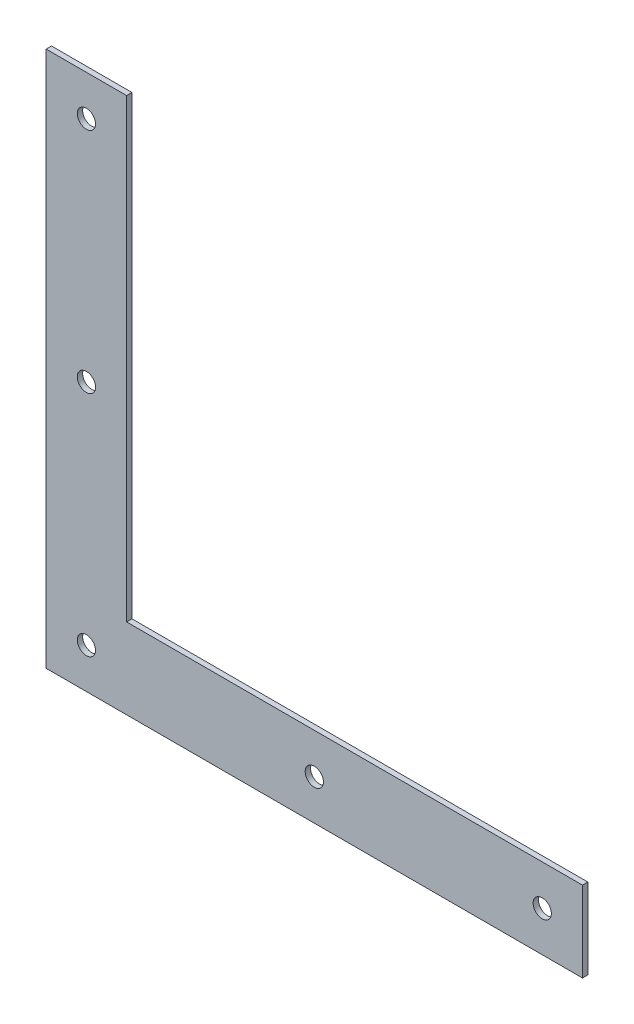
ISO-10303-21;
HEADER;
FILE_DESCRIPTION(('STEP AP214'),'2;1');
FILE_NAME('part.step','',(''),(''),'','','');
FILE_SCHEMA(('AUTOMOTIVE_DESIGN { 1 0 10303 214 1 1 1 1 }'));
ENDSEC;
DATA;
#1=APPLICATION_CONTEXT('core data for automotive mechanical design processes');
#2=APPLICATION_PROTOCOL_DEFINITION('international standard','automotive_design',2000,#1);
#3=PRODUCT_CONTEXT('',#1,'mechanical');
#4=PRODUCT('Part','Part','',(#3));
#5=PRODUCT_RELATED_PRODUCT_CATEGORY('part','',(#4));
#6=PRODUCT_DEFINITION_FORMATION('','',#4);
#7=PRODUCT_DEFINITION_CONTEXT('part definition',#1,'design');
#8=PRODUCT_DEFINITION('design','',#6,#7);
#9=PRODUCT_DEFINITION_SHAPE('','',#8);
#10=(LENGTH_UNIT() NAMED_UNIT(*) SI_UNIT(.MILLI.,.METRE.));
#11=(NAMED_UNIT(*) PLANE_ANGLE_UNIT() SI_UNIT($,.RADIAN.));
#12=(NAMED_UNIT(*) SI_UNIT($,.STERADIAN.) SOLID_ANGLE_UNIT());
#13=UNCERTAINTY_MEASURE_WITH_UNIT(LENGTH_MEASURE(1.E-05),#10,'distance_accuracy_value','');
#14=(GEOMETRIC_REPRESENTATION_CONTEXT(3) GLOBAL_UNCERTAINTY_ASSIGNED_CONTEXT((#13)) GLOBAL_UNIT_ASSIGNED_CONTEXT((#10,
#11,#12)) REPRESENTATION_CONTEXT('',''));
#15=CARTESIAN_POINT('',(0.,0.,0.));
#16=DIRECTION('',(0.,0.,1.));
#17=DIRECTION('',(1.,0.,0.));
#18=AXIS2_PLACEMENT_3D('',#15,#16,#17);
#19=CARTESIAN_POINT('',(100.,0.,1.));
#20=DIRECTION('',(0.,1.,0.));
#21=DIRECTION('',(-1.,0.,0.));
#22=AXIS2_PLACEMENT_3D('',#19,#20,#21);
#23=PLANE('',#22);
#24=DIRECTION('',(1.,0.,0.));
#25=VECTOR('',#24,1.);
#26=CARTESIAN_POINT('',(100.,0.,0.));
#27=LINE('',#26,#25);
#28=CARTESIAN_POINT('',(0.,0.,0.));
#29=VERTEX_POINT('',#28);
#30=CARTESIAN_POINT('',(100.,0.,0.));
#31=VERTEX_POINT('',#30);
#32=EDGE_CURVE('E116',#29,#31,#27,.T.);
#33=ORIENTED_EDGE('',*,*,#32,.T.);
#34=DIRECTION('',(0.,0.,-1.));
#35=VECTOR('',#34,1.);
#36=CARTESIAN_POINT('',(100.,0.,1.));
#37=LINE('',#36,#35);
#38=CARTESIAN_POINT('',(100.,0.,1.));
#39=VERTEX_POINT('',#38);
#40=EDGE_CURVE('E11',#39,#31,#37,.T.);
#41=ORIENTED_EDGE('',*,*,#40,.F.);
#42=DIRECTION('',(1.,0.,0.));
#43=VECTOR('',#42,1.);
#44=CARTESIAN_POINT('',(100.,0.,1.));
#45=LINE('',#44,#43);
#46=CARTESIAN_POINT('',(0.,0.,1.));
#47=VERTEX_POINT('',#46);
#48=EDGE_CURVE('E127',#47,#39,#45,.T.);
#49=ORIENTED_EDGE('',*,*,#48,.F.);
#50=DIRECTION('',(0.,0.,-1.));
#51=VECTOR('',#50,1.);
#52=CARTESIAN_POINT('',(0.,0.,1.));
#53=LINE('',#52,#51);
#54=EDGE_CURVE('E112',#47,#29,#53,.T.);
#55=ORIENTED_EDGE('',*,*,#54,.T.);
#56=EDGE_LOOP('',(#33,#41,#49,#55));
#57=FACE_BOUND('',#56,.T.);
#58=ADVANCED_FACE('F32',(#57),#23,.F.);
#59=CARTESIAN_POINT('',(100.,15.,1.));
#60=DIRECTION('',(-1.,0.,0.));
#61=DIRECTION('',(0.,0.,1.));
#62=AXIS2_PLACEMENT_3D('',#59,#60,#61);
#63=PLANE('',#62);
#64=DIRECTION('',(0.,1.,0.));
#65=VECTOR('',#64,1.);
#66=CARTESIAN_POINT('',(100.,15.,0.));
#67=LINE('',#66,#65);
#68=CARTESIAN_POINT('',(100.,15.,0.));
#69=VERTEX_POINT('',#68);
#70=EDGE_CURVE('E119',#31,#69,#67,.T.);
#71=ORIENTED_EDGE('',*,*,#70,.T.);
#72=DIRECTION('',(0.,0.,-1.));
#73=VECTOR('',#72,1.);
#74=CARTESIAN_POINT('',(100.,15.,1.));
#75=LINE('',#74,#73);
#76=CARTESIAN_POINT('',(100.,15.,1.));
#77=VERTEX_POINT('',#76);
#78=EDGE_CURVE('E40',#77,#69,#75,.T.);
#79=ORIENTED_EDGE('',*,*,#78,.F.);
#80=DIRECTION('',(0.,1.,0.));
#81=VECTOR('',#80,1.);
#82=CARTESIAN_POINT('',(100.,15.,1.));
#83=LINE('',#82,#81);
#84=EDGE_CURVE('E85',#39,#77,#83,.T.);
#85=ORIENTED_EDGE('',*,*,#84,.F.);
#86=ORIENTED_EDGE('',*,*,#40,.T.);
#87=EDGE_LOOP('',(#71,#79,#85,#86));
#88=FACE_BOUND('',#87,.T.);
#89=ADVANCED_FACE('F152',(#88),#63,.F.);
#90=CARTESIAN_POINT('',(15.,15.,1.));
#91=DIRECTION('',(0.,-1.,0.));
#92=DIRECTION('',(0.,0.,-1.));
#93=AXIS2_PLACEMENT_3D('',#90,#91,#92);
#94=PLANE('',#93);
#95=DIRECTION('',(-1.,0.,0.));
#96=VECTOR('',#95,1.);
#97=CARTESIAN_POINT('',(15.,15.,0.));
#98=LINE('',#97,#96);
#99=CARTESIAN_POINT('',(15.,15.,0.));
#100=VERTEX_POINT('',#99);
#101=EDGE_CURVE('E122',#69,#100,#98,.T.);
#102=ORIENTED_EDGE('',*,*,#101,.T.);
#103=DIRECTION('',(0.,0.,-1.));
#104=VECTOR('',#103,1.);
#105=CARTESIAN_POINT('',(15.,15.,1.));
#106=LINE('',#105,#104);
#107=CARTESIAN_POINT('',(15.,15.,1.));
#108=VERTEX_POINT('',#107);
#109=EDGE_CURVE('E107',#108,#100,#106,.T.);
#110=ORIENTED_EDGE('',*,*,#109,.F.);
#111=DIRECTION('',(-1.,0.,0.));
#112=VECTOR('',#111,1.);
#113=CARTESIAN_POINT('',(15.,15.,1.));
#114=LINE('',#113,#112);
#115=EDGE_CURVE('E98',#77,#108,#114,.T.);
#116=ORIENTED_EDGE('',*,*,#115,.F.);
#117=ORIENTED_EDGE('',*,*,#78,.T.);
#118=EDGE_LOOP('',(#102,#110,#116,#117));
#119=FACE_BOUND('',#118,.T.);
#120=ADVANCED_FACE('F133',(#119),#94,.F.);
#121=CARTESIAN_POINT('',(15.,100.,1.));
#122=DIRECTION('',(-1.,0.,0.));
#123=DIRECTION('',(0.,-1.,0.));
#124=AXIS2_PLACEMENT_3D('',#121,#122,#123);
#125=PLANE('',#124);
#126=DIRECTION('',(0.,1.,0.));
#127=VECTOR('',#126,1.);
#128=CARTESIAN_POINT('',(15.,100.,0.));
#129=LINE('',#128,#127);
#130=CARTESIAN_POINT('',(15.,100.,0.));
#131=VERTEX_POINT('',#130);
#132=EDGE_CURVE('E106',#100,#131,#129,.T.);
#133=ORIENTED_EDGE('',*,*,#132,.T.);
#134=DIRECTION('',(0.,0.,-1.));
#135=VECTOR('',#134,1.);
#136=CARTESIAN_POINT('',(15.,100.,1.));
#137=LINE('',#136,#135);
#138=CARTESIAN_POINT('',(15.,100.,1.));
#139=VERTEX_POINT('',#138);
#140=EDGE_CURVE('E103',#139,#131,#137,.T.);
#141=ORIENTED_EDGE('',*,*,#140,.F.);
#142=DIRECTION('',(0.,1.,0.));
#143=VECTOR('',#142,1.);
#144=CARTESIAN_POINT('',(15.,100.,1.));
#145=LINE('',#144,#143);
#146=EDGE_CURVE('E92',#108,#139,#145,.T.);
#147=ORIENTED_EDGE('',*,*,#146,.F.);
#148=ORIENTED_EDGE('',*,*,#109,.T.);
#149=EDGE_LOOP('',(#133,#141,#147,#148));
#150=FACE_BOUND('',#149,.T.);
#151=ADVANCED_FACE('F104',(#150),#125,.F.);
#152=CARTESIAN_POINT('',(0.,100.,1.));
#153=DIRECTION('',(0.,-1.,0.));
#154=DIRECTION('',(0.,0.,-1.));
#155=AXIS2_PLACEMENT_3D('',#152,#153,#154);
#156=PLANE('',#155);
#157=DIRECTION('',(-1.,0.,0.));
#158=VECTOR('',#157,1.);
#159=CARTESIAN_POINT('',(0.,100.,0.));
#160=LINE('',#159,#158);
#161=CARTESIAN_POINT('',(0.,100.,0.));
#162=VERTEX_POINT('',#161);
#163=EDGE_CURVE('E71',#131,#162,#160,.T.);
#164=ORIENTED_EDGE('',*,*,#163,.T.);
#165=DIRECTION('',(0.,0.,-1.));
#166=VECTOR('',#165,1.);
#167=CARTESIAN_POINT('',(0.,100.,1.));
#168=LINE('',#167,#166);
#169=CARTESIAN_POINT('',(0.,100.,1.));
#170=VERTEX_POINT('',#169);
#171=EDGE_CURVE('E108',#170,#162,#168,.T.);
#172=ORIENTED_EDGE('',*,*,#171,.F.);
#173=DIRECTION('',(-1.,0.,0.));
#174=VECTOR('',#173,1.);
#175=CARTESIAN_POINT('',(0.,100.,1.));
#176=LINE('',#175,#174);
#177=EDGE_CURVE('E96',#139,#170,#176,.T.);
#178=ORIENTED_EDGE('',*,*,#177,.F.);
#179=ORIENTED_EDGE('',*,*,#140,.T.);
#180=EDGE_LOOP('',(#164,#172,#178,#179));
#181=FACE_BOUND('',#180,.T.);
#182=ADVANCED_FACE('F110',(#181),#156,.F.);
#183=CARTESIAN_POINT('',(0.,0.,1.));
#184=DIRECTION('',(1.,0.,0.));
#185=DIRECTION('',(0.,0.,-1.));
#186=AXIS2_PLACEMENT_3D('',#183,#184,#185);
#187=PLANE('',#186);
#188=DIRECTION('',(0.,-1.,0.));
#189=VECTOR('',#188,1.);
#190=CARTESIAN_POINT('',(0.,0.,0.));
#191=LINE('',#190,#189);
#192=EDGE_CURVE('E77',#162,#29,#191,.T.);
#193=ORIENTED_EDGE('',*,*,#192,.T.);
#194=ORIENTED_EDGE('',*,*,#54,.F.);
#195=DIRECTION('',(0.,-1.,0.));
#196=VECTOR('',#195,1.);
#197=CARTESIAN_POINT('',(0.,0.,1.));
#198=LINE('',#197,#196);
#199=EDGE_CURVE('E48',#170,#47,#198,.T.);
#200=ORIENTED_EDGE('',*,*,#199,.F.);
#201=ORIENTED_EDGE('',*,*,#171,.T.);
#202=EDGE_LOOP('',(#193,#194,#200,#201));
#203=FACE_BOUND('',#202,.T.);
#204=ADVANCED_FACE('F140',(#203),#187,.F.);
#205=CARTESIAN_POINT('',(0.,0.,1.));
#206=DIRECTION('',(0.,0.,-1.));
#207=DIRECTION('',(-1.,0.,0.));
#208=AXIS2_PLACEMENT_3D('',#205,#206,#207);
#209=PLANE('',#208);
#210=CARTESIAN_POINT('',(92.5,7.50000000000001,1.));
#211=DIRECTION('',(0.,0.,-1.));
#212=DIRECTION('',(-1.,0.,0.));
#213=AXIS2_PLACEMENT_3D('',#210,#211,#212);
#214=CIRCLE('',#213,1.69999999999999);
#215=CARTESIAN_POINT('',(90.8,7.50000000000001,1.));
#216=VERTEX_POINT('',#215);
#217=EDGE_CURVE('E245',#216,#216,#214,.T.);
#218=ORIENTED_EDGE('',*,*,#217,.T.);
#219=EDGE_LOOP('',(#218));
#220=FACE_BOUND('',#219,.T.);
#221=CARTESIAN_POINT('',(7.5,7.50000000000001,1.));
#222=DIRECTION('',(0.,0.,-1.));
#223=DIRECTION('',(-1.,0.,0.));
#224=AXIS2_PLACEMENT_3D('',#221,#222,#223);
#225=CIRCLE('',#224,1.7);
#226=CARTESIAN_POINT('',(5.8,7.50000000000001,1.));
#227=VERTEX_POINT('',#226);
#228=EDGE_CURVE('E255',#227,#227,#225,.T.);
#229=ORIENTED_EDGE('',*,*,#228,.T.);
#230=EDGE_LOOP('',(#229));
#231=FACE_BOUND('',#230,.T.);
#232=CARTESIAN_POINT('',(7.5,92.5,1.));
#233=DIRECTION('',(0.,0.,-1.));
#234=DIRECTION('',(-1.,0.,0.));
#235=AXIS2_PLACEMENT_3D('',#232,#233,#234);
#236=CIRCLE('',#235,1.7);
#237=CARTESIAN_POINT('',(5.8,92.5,1.));
#238=VERTEX_POINT('',#237);
#239=EDGE_CURVE('E261',#238,#238,#236,.T.);
#240=ORIENTED_EDGE('',*,*,#239,.T.);
#241=EDGE_LOOP('',(#240));
#242=FACE_BOUND('',#241,.T.);
#243=CARTESIAN_POINT('',(7.5,50.,1.));
#244=DIRECTION('',(0.,0.,-1.));
#245=DIRECTION('',(-1.,0.,0.));
#246=AXIS2_PLACEMENT_3D('',#243,#244,#245);
#247=CIRCLE('',#246,1.7);
#248=CARTESIAN_POINT('',(5.8,50.,1.));
#249=VERTEX_POINT('',#248);
#250=EDGE_CURVE('E267',#249,#249,#247,.T.);
#251=ORIENTED_EDGE('',*,*,#250,.T.);
#252=EDGE_LOOP('',(#251));
#253=FACE_BOUND('',#252,.T.);
#254=CARTESIAN_POINT('',(50.,7.50000000000001,1.));
#255=DIRECTION('',(0.,0.,-1.));
#256=DIRECTION('',(-1.,0.,0.));
#257=AXIS2_PLACEMENT_3D('',#254,#255,#256);
#258=CIRCLE('',#257,1.7);
#259=CARTESIAN_POINT('',(48.3,7.50000000000001,1.));
#260=VERTEX_POINT('',#259);
#261=EDGE_CURVE('E120',#260,#260,#258,.T.);
#262=ORIENTED_EDGE('',*,*,#261,.T.);
#263=EDGE_LOOP('',(#262));
#264=FACE_BOUND('',#263,.T.);
#265=ORIENTED_EDGE('',*,*,#48,.T.);
#266=ORIENTED_EDGE('',*,*,#84,.T.);
#267=ORIENTED_EDGE('',*,*,#115,.T.);
#268=ORIENTED_EDGE('',*,*,#146,.T.);
#269=ORIENTED_EDGE('',*,*,#177,.T.);
#270=ORIENTED_EDGE('',*,*,#199,.T.);
#271=EDGE_LOOP('',(#265,#266,#267,#268,#269,#270));
#272=FACE_BOUND('',#271,.T.);
#273=ADVANCED_FACE('F94',(#220,#231,#242,#253,#264,#272),#209,.F.);
#274=CARTESIAN_POINT('',(0.,0.,0.));
#275=DIRECTION('',(0.,0.,-1.));
#276=DIRECTION('',(-1.,0.,0.));
#277=AXIS2_PLACEMENT_3D('',#274,#275,#276);
#278=PLANE('',#277);
#279=CARTESIAN_POINT('',(92.5,7.50000000000001,0.));
#280=DIRECTION('',(0.,0.,-1.));
#281=DIRECTION('',(-1.,0.,0.));
#282=AXIS2_PLACEMENT_3D('',#279,#280,#281);
#283=CIRCLE('',#282,1.69999999999999);
#284=CARTESIAN_POINT('',(90.8,7.50000000000001,0.));
#285=VERTEX_POINT('',#284);
#286=EDGE_CURVE('E248',#285,#285,#283,.T.);
#287=ORIENTED_EDGE('',*,*,#286,.F.);
#288=EDGE_LOOP('',(#287));
#289=FACE_BOUND('',#288,.T.);
#290=CARTESIAN_POINT('',(7.5,7.50000000000001,0.));
#291=DIRECTION('',(0.,0.,-1.));
#292=DIRECTION('',(-1.,0.,0.));
#293=AXIS2_PLACEMENT_3D('',#290,#291,#292);
#294=CIRCLE('',#293,1.69999999999999);
#295=CARTESIAN_POINT('',(5.80000000000001,7.50000000000001,0.));
#296=VERTEX_POINT('',#295);
#297=EDGE_CURVE('E250',#296,#296,#294,.T.);
#298=ORIENTED_EDGE('',*,*,#297,.F.);
#299=EDGE_LOOP('',(#298));
#300=FACE_BOUND('',#299,.T.);
#301=CARTESIAN_POINT('',(7.5,92.5,0.));
#302=DIRECTION('',(0.,0.,-1.));
#303=DIRECTION('',(-1.,0.,0.));
#304=AXIS2_PLACEMENT_3D('',#301,#302,#303);
#305=CIRCLE('',#304,1.69999999999999);
#306=CARTESIAN_POINT('',(5.80000000000001,92.5,0.));
#307=VERTEX_POINT('',#306);
#308=EDGE_CURVE('E258',#307,#307,#305,.T.);
#309=ORIENTED_EDGE('',*,*,#308,.F.);
#310=EDGE_LOOP('',(#309));
#311=FACE_BOUND('',#310,.T.);
#312=CARTESIAN_POINT('',(7.5,50.,0.));
#313=DIRECTION('',(0.,0.,-1.));
#314=DIRECTION('',(-1.,0.,0.));
#315=AXIS2_PLACEMENT_3D('',#312,#313,#314);
#316=CIRCLE('',#315,1.69999999999999);
#317=CARTESIAN_POINT('',(5.80000000000001,50.,0.));
#318=VERTEX_POINT('',#317);
#319=EDGE_CURVE('E264',#318,#318,#316,.T.);
#320=ORIENTED_EDGE('',*,*,#319,.F.);
#321=EDGE_LOOP('',(#320));
#322=FACE_BOUND('',#321,.T.);
#323=CARTESIAN_POINT('',(50.,7.50000000000001,0.));
#324=DIRECTION('',(0.,0.,-1.));
#325=DIRECTION('',(-1.,0.,0.));
#326=AXIS2_PLACEMENT_3D('',#323,#324,#325);
#327=CIRCLE('',#326,1.69999999999999);
#328=CARTESIAN_POINT('',(48.3,7.50000000000001,0.));
#329=VERTEX_POINT('',#328);
#330=EDGE_CURVE('E270',#329,#329,#327,.T.);
#331=ORIENTED_EDGE('',*,*,#330,.F.);
#332=EDGE_LOOP('',(#331));
#333=FACE_BOUND('',#332,.T.);
#334=ORIENTED_EDGE('',*,*,#32,.F.);
#335=ORIENTED_EDGE('',*,*,#192,.F.);
#336=ORIENTED_EDGE('',*,*,#163,.F.);
#337=ORIENTED_EDGE('',*,*,#132,.F.);
#338=ORIENTED_EDGE('',*,*,#101,.F.);
#339=ORIENTED_EDGE('',*,*,#70,.F.);
#340=EDGE_LOOP('',(#334,#335,#336,#337,#338,#339));
#341=FACE_BOUND('',#340,.T.);
#342=ADVANCED_FACE('F136',(#289,#300,#311,#322,#333,#341),#278,.T.);
#343=CARTESIAN_POINT('',(50.,7.50000000000001,0.));
#344=DIRECTION('',(0.,0.,-1.));
#345=DIRECTION('',(-1.,0.,0.));
#346=AXIS2_PLACEMENT_3D('',#343,#344,#345);
#347=CYLINDRICAL_SURFACE('',#346,1.69999999999999);
#348=ORIENTED_EDGE('',*,*,#261,.F.);
#349=EDGE_LOOP('',(#348));
#350=FACE_BOUND('',#349,.T.);
#351=ORIENTED_EDGE('',*,*,#330,.T.);
#352=EDGE_LOOP('',(#351));
#353=FACE_BOUND('',#352,.T.);
#354=ADVANCED_FACE('F189',(#350,#353),#347,.F.);
#355=CARTESIAN_POINT('',(7.5,50.,0.));
#356=DIRECTION('',(0.,0.,-1.));
#357=DIRECTION('',(-1.,0.,0.));
#358=AXIS2_PLACEMENT_3D('',#355,#356,#357);
#359=CYLINDRICAL_SURFACE('',#358,1.69999999999999);
#360=ORIENTED_EDGE('',*,*,#250,.F.);
#361=EDGE_LOOP('',(#360));
#362=FACE_BOUND('',#361,.T.);
#363=ORIENTED_EDGE('',*,*,#319,.T.);
#364=EDGE_LOOP('',(#363));
#365=FACE_BOUND('',#364,.T.);
#366=ADVANCED_FACE('F198',(#362,#365),#359,.F.);
#367=CARTESIAN_POINT('',(7.5,92.5,0.));
#368=DIRECTION('',(0.,0.,-1.));
#369=DIRECTION('',(-1.,0.,0.));
#370=AXIS2_PLACEMENT_3D('',#367,#368,#369);
#371=CYLINDRICAL_SURFACE('',#370,1.69999999999999);
#372=ORIENTED_EDGE('',*,*,#239,.F.);
#373=EDGE_LOOP('',(#372));
#374=FACE_BOUND('',#373,.T.);
#375=ORIENTED_EDGE('',*,*,#308,.T.);
#376=EDGE_LOOP('',(#375));
#377=FACE_BOUND('',#376,.T.);
#378=ADVANCED_FACE('F208',(#374,#377),#371,.F.);
#379=CARTESIAN_POINT('',(7.5,7.50000000000001,0.));
#380=DIRECTION('',(0.,0.,-1.));
#381=DIRECTION('',(-1.,0.,0.));
#382=AXIS2_PLACEMENT_3D('',#379,#380,#381);
#383=CYLINDRICAL_SURFACE('',#382,1.69999999999999);
#384=ORIENTED_EDGE('',*,*,#228,.F.);
#385=EDGE_LOOP('',(#384));
#386=FACE_BOUND('',#385,.T.);
#387=ORIENTED_EDGE('',*,*,#297,.T.);
#388=EDGE_LOOP('',(#387));
#389=FACE_BOUND('',#388,.T.);
#390=ADVANCED_FACE('F218',(#386,#389),#383,.F.);
#391=CARTESIAN_POINT('',(92.5,7.50000000000001,0.));
#392=DIRECTION('',(0.,0.,-1.));
#393=DIRECTION('',(-1.,0.,0.));
#394=AXIS2_PLACEMENT_3D('',#391,#392,#393);
#395=CYLINDRICAL_SURFACE('',#394,1.69999999999999);
#396=ORIENTED_EDGE('',*,*,#217,.F.);
#397=EDGE_LOOP('',(#396));
#398=FACE_BOUND('',#397,.T.);
#399=ORIENTED_EDGE('',*,*,#286,.T.);
#400=EDGE_LOOP('',(#399));
#401=FACE_BOUND('',#400,.T.);
#402=ADVANCED_FACE('F228',(#398,#401),#395,.F.);
#403=CLOSED_SHELL('',(#58,#89,#120,#151,#182,#204,#273,#342,#354,#366,#378,#390,#402));
#404=MANIFOLD_SOLID_BREP('B2',#403);
#405=ADVANCED_BREP_SHAPE_REPRESENTATION('',(#18,#404),#14);
#406=SHAPE_DEFINITION_REPRESENTATION(#9,#405);
ENDSEC;
END-ISO-10303-21;
